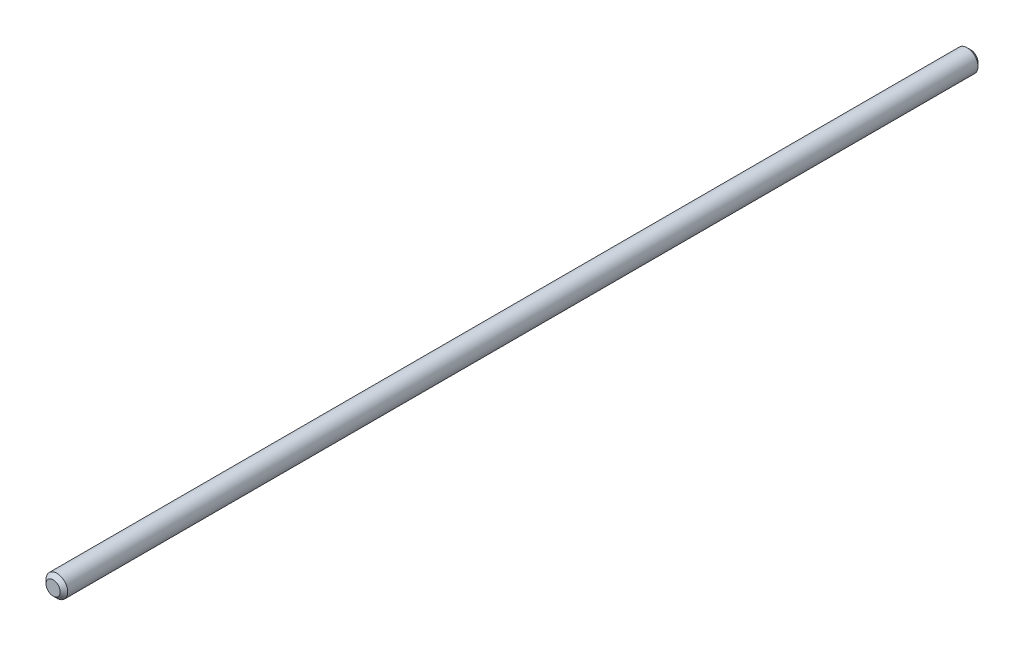
ISO-10303-21;
HEADER;
FILE_DESCRIPTION(('STEP AP214'),'2;1');
FILE_NAME('part.step','',(''),(''),'','','');
FILE_SCHEMA(('AUTOMOTIVE_DESIGN { 1 0 10303 214 1 1 1 1 }'));
ENDSEC;
DATA;
#1=APPLICATION_CONTEXT('core data for automotive mechanical design processes');
#2=APPLICATION_PROTOCOL_DEFINITION('international standard','automotive_design',2000,#1);
#3=PRODUCT_CONTEXT('',#1,'mechanical');
#4=PRODUCT('Part','Part','',(#3));
#5=PRODUCT_RELATED_PRODUCT_CATEGORY('part','',(#4));
#6=PRODUCT_DEFINITION_FORMATION('','',#4);
#7=PRODUCT_DEFINITION_CONTEXT('part definition',#1,'design');
#8=PRODUCT_DEFINITION('design','',#6,#7);
#9=PRODUCT_DEFINITION_SHAPE('','',#8);
#10=(LENGTH_UNIT() NAMED_UNIT(*) SI_UNIT(.MILLI.,.METRE.));
#11=(NAMED_UNIT(*) PLANE_ANGLE_UNIT() SI_UNIT($,.RADIAN.));
#12=(NAMED_UNIT(*) SI_UNIT($,.STERADIAN.) SOLID_ANGLE_UNIT());
#13=UNCERTAINTY_MEASURE_WITH_UNIT(LENGTH_MEASURE(1.E-05),#10,'distance_accuracy_value','');
#14=(GEOMETRIC_REPRESENTATION_CONTEXT(3) GLOBAL_UNCERTAINTY_ASSIGNED_CONTEXT((#13)) GLOBAL_UNIT_ASSIGNED_CONTEXT((#10,
#11,#12)) REPRESENTATION_CONTEXT('',''));
#15=CARTESIAN_POINT('',(0.,0.,0.));
#16=DIRECTION('',(0.,0.,1.));
#17=DIRECTION('',(1.,0.,0.));
#18=AXIS2_PLACEMENT_3D('',#15,#16,#17);
#19=CARTESIAN_POINT('',(0.,0.,245.));
#20=DIRECTION('',(0.,0.,-1.));
#21=DIRECTION('',(-1.,0.,0.));
#22=AXIS2_PLACEMENT_3D('',#19,#20,#21);
#23=CYLINDRICAL_SURFACE('',#22,2.9);
#24=CARTESIAN_POINT('',(0.,0.,244.));
#25=DIRECTION('',(0.,0.,1.));
#26=DIRECTION('',(1.,0.,0.));
#27=AXIS2_PLACEMENT_3D('',#24,#25,#26);
#28=CIRCLE('',#27,2.9);
#29=CARTESIAN_POINT('',(2.9,0.,244.));
#30=VERTEX_POINT('',#29);
#31=EDGE_CURVE('E40',#30,#30,#28,.F.);
#32=ORIENTED_EDGE('',*,*,#31,.T.);
#33=EDGE_LOOP('',(#32));
#34=FACE_BOUND('',#33,.T.);
#35=CARTESIAN_POINT('',(0.,0.,1.00000000000003));
#36=DIRECTION('',(0.,0.,1.));
#37=DIRECTION('',(1.,0.,0.));
#38=AXIS2_PLACEMENT_3D('',#35,#36,#37);
#39=CIRCLE('',#38,2.9);
#40=CARTESIAN_POINT('',(2.9,0.,1.00000000000003));
#41=VERTEX_POINT('',#40);
#42=EDGE_CURVE('E44',#41,#41,#39,.T.);
#43=ORIENTED_EDGE('',*,*,#42,.T.);
#44=EDGE_LOOP('',(#43));
#45=FACE_BOUND('',#44,.T.);
#46=ADVANCED_FACE('F33',(#34,#45),#23,.T.);
#47=CARTESIAN_POINT('',(0.,0.,245.));
#48=DIRECTION('',(0.,0.,1.));
#49=DIRECTION('',(1.,0.,0.));
#50=AXIS2_PLACEMENT_3D('',#47,#48,#49);
#51=PLANE('',#50);
#52=CARTESIAN_POINT('',(0.,0.,245.));
#53=DIRECTION('',(0.,0.,1.));
#54=DIRECTION('',(1.,0.,0.));
#55=AXIS2_PLACEMENT_3D('',#52,#53,#54);
#56=CIRCLE('',#55,1.90000000000001);
#57=CARTESIAN_POINT('',(1.90000000000001,0.,245.));
#58=VERTEX_POINT('',#57);
#59=EDGE_CURVE('E48',#58,#58,#56,.T.);
#60=ORIENTED_EDGE('',*,*,#59,.T.);
#61=EDGE_LOOP('',(#60));
#62=FACE_BOUND('',#61,.T.);
#63=ADVANCED_FACE('F54',(#62),#51,.T.);
#64=CARTESIAN_POINT('',(0.,0.,0.));
#65=DIRECTION('',(0.,0.,1.));
#66=DIRECTION('',(1.,0.,0.));
#67=AXIS2_PLACEMENT_3D('',#64,#65,#66);
#68=PLANE('',#67);
#69=CARTESIAN_POINT('',(0.,0.,0.));
#70=DIRECTION('',(0.,0.,1.));
#71=DIRECTION('',(1.,0.,0.));
#72=AXIS2_PLACEMENT_3D('',#69,#70,#71);
#73=CIRCLE('',#72,1.89999999999996);
#74=CARTESIAN_POINT('',(1.89999999999996,0.,0.));
#75=VERTEX_POINT('',#74);
#76=EDGE_CURVE('E10',#75,#75,#73,.F.);
#77=ORIENTED_EDGE('',*,*,#76,.T.);
#78=EDGE_LOOP('',(#77));
#79=FACE_BOUND('',#78,.T.);
#80=ADVANCED_FACE('F58',(#79),#68,.F.);
#81=CARTESIAN_POINT('',(0.,0.,245.));
#82=DIRECTION('',(0.,0.,-1.));
#83=DIRECTION('',(-1.,0.,0.));
#84=AXIS2_PLACEMENT_3D('',#81,#82,#83);
#85=CONICAL_SURFACE('',#84,1.90000000000001,0.785398163397455);
#86=ORIENTED_EDGE('',*,*,#31,.F.);
#87=EDGE_LOOP('',(#86));
#88=FACE_BOUND('',#87,.T.);
#89=ORIENTED_EDGE('',*,*,#59,.F.);
#90=EDGE_LOOP('',(#89));
#91=FACE_BOUND('',#90,.T.);
#92=ADVANCED_FACE('F56',(#88,#91),#85,.T.);
#93=CARTESIAN_POINT('',(0.,0.,1.00000000000003));
#94=DIRECTION('',(0.,0.,1.));
#95=DIRECTION('',(1.,0.,0.));
#96=AXIS2_PLACEMENT_3D('',#93,#94,#95);
#97=CONICAL_SURFACE('',#96,2.9,0.785398163397455);
#98=ORIENTED_EDGE('',*,*,#76,.F.);
#99=EDGE_LOOP('',(#98));
#100=FACE_BOUND('',#99,.T.);
#101=ORIENTED_EDGE('',*,*,#42,.F.);
#102=EDGE_LOOP('',(#101));
#103=FACE_BOUND('',#102,.T.);
#104=ADVANCED_FACE('F35',(#100,#103),#97,.T.);
#105=CLOSED_SHELL('',(#46,#63,#80,#92,#104));
#106=MANIFOLD_SOLID_BREP('B2',#105);
#107=ADVANCED_BREP_SHAPE_REPRESENTATION('',(#18,#106),#14);
#108=SHAPE_DEFINITION_REPRESENTATION(#9,#107);
ENDSEC;
END-ISO-10303-21;
